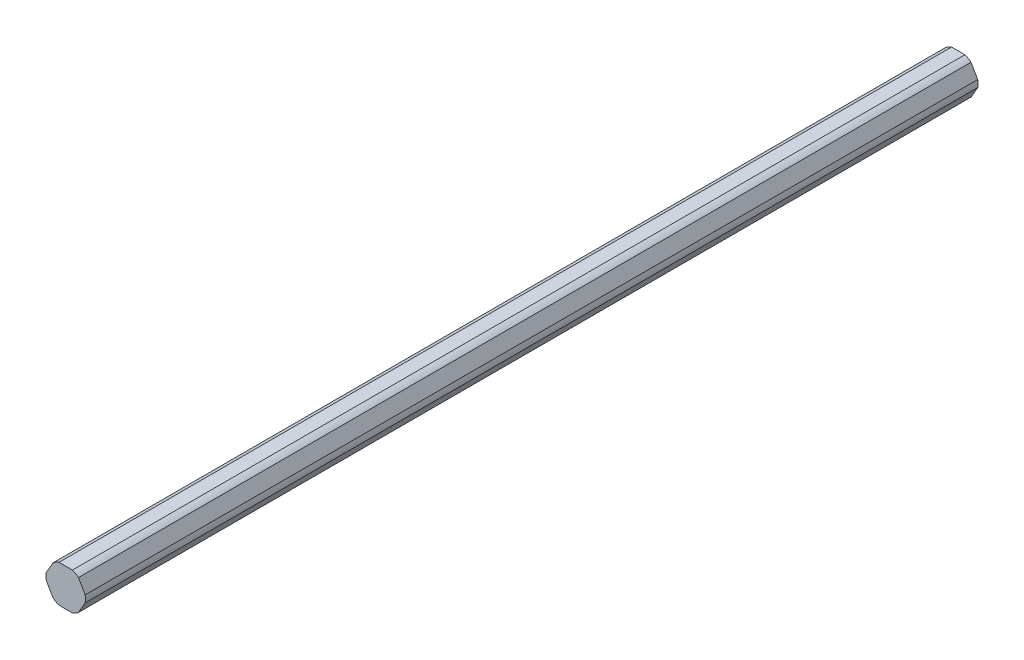
ISO-10303-21;
HEADER;
FILE_DESCRIPTION(('STEP AP214'),'2;1');
FILE_NAME('part.step','',(''),(''),'','','');
FILE_SCHEMA(('AUTOMOTIVE_DESIGN { 1 0 10303 214 1 1 1 1 }'));
ENDSEC;
DATA;
#1=APPLICATION_CONTEXT('core data for automotive mechanical design processes');
#2=APPLICATION_PROTOCOL_DEFINITION('international standard','automotive_design',2000,#1);
#3=PRODUCT_CONTEXT('',#1,'mechanical');
#4=PRODUCT('Part','Part','',(#3));
#5=PRODUCT_RELATED_PRODUCT_CATEGORY('part','',(#4));
#6=PRODUCT_DEFINITION_FORMATION('','',#4);
#7=PRODUCT_DEFINITION_CONTEXT('part definition',#1,'design');
#8=PRODUCT_DEFINITION('design','',#6,#7);
#9=PRODUCT_DEFINITION_SHAPE('','',#8);
#10=(LENGTH_UNIT() NAMED_UNIT(*) SI_UNIT(.MILLI.,.METRE.));
#11=(NAMED_UNIT(*) PLANE_ANGLE_UNIT() SI_UNIT($,.RADIAN.));
#12=(NAMED_UNIT(*) SI_UNIT($,.STERADIAN.) SOLID_ANGLE_UNIT());
#13=UNCERTAINTY_MEASURE_WITH_UNIT(LENGTH_MEASURE(1.E-05),#10,'distance_accuracy_value','');
#14=(GEOMETRIC_REPRESENTATION_CONTEXT(3) GLOBAL_UNCERTAINTY_ASSIGNED_CONTEXT((#13)) GLOBAL_UNIT_ASSIGNED_CONTEXT((#10,
#11,#12)) REPRESENTATION_CONTEXT('',''));
#15=CARTESIAN_POINT('',(0.,0.,0.));
#16=DIRECTION('',(0.,0.,1.));
#17=DIRECTION('',(1.,0.,0.));
#18=AXIS2_PLACEMENT_3D('',#15,#16,#17);
#19=CARTESIAN_POINT('',(5.49926131403119,3.175,304.8));
#20=DIRECTION('',(-0.866025403784439,-0.5,0.));
#21=DIRECTION('',(0.5,-0.866025403784439,0.));
#22=AXIS2_PLACEMENT_3D('',#19,#20,#21);
#23=PLANE('',#22);
#24=DIRECTION('',(-0.5,0.866025403784439,0.));
#25=VECTOR('',#24,1.);
#26=CARTESIAN_POINT('',(5.49926131403119,3.175,0.));
#27=LINE('',#26,#25);
#28=CARTESIAN_POINT('',(6.64381362825714,1.19257723984011,0.));
#29=VERTEX_POINT('',#28);
#30=CARTESIAN_POINT('',(4.35470899980524,5.15742276015989,0.));
#31=VERTEX_POINT('',#30);
#32=EDGE_CURVE('E153',#29,#31,#27,.T.);
#33=ORIENTED_EDGE('',*,*,#32,.T.);
#34=DIRECTION('',(0.,0.,-1.));
#35=VECTOR('',#34,1.);
#36=CARTESIAN_POINT('',(4.35470899980524,5.15742276015989,304.8));
#37=LINE('',#36,#35);
#38=CARTESIAN_POINT('',(4.35470899980524,5.15742276015989,304.8));
#39=VERTEX_POINT('',#38);
#40=EDGE_CURVE('E11',#39,#31,#37,.T.);
#41=ORIENTED_EDGE('',*,*,#40,.F.);
#42=DIRECTION('',(-0.5,0.866025403784439,0.));
#43=VECTOR('',#42,1.);
#44=CARTESIAN_POINT('',(5.49926131403119,3.175,304.8));
#45=LINE('',#44,#43);
#46=CARTESIAN_POINT('',(6.64381362825714,1.19257723984011,304.8));
#47=VERTEX_POINT('',#46);
#48=EDGE_CURVE('E210',#47,#39,#45,.T.);
#49=ORIENTED_EDGE('',*,*,#48,.F.);
#50=DIRECTION('',(0.,0.,-1.));
#51=VECTOR('',#50,1.);
#52=CARTESIAN_POINT('',(6.64381362825714,1.19257723984011,304.8));
#53=LINE('',#52,#51);
#54=EDGE_CURVE('E149',#47,#29,#53,.T.);
#55=ORIENTED_EDGE('',*,*,#54,.T.);
#56=EDGE_LOOP('',(#33,#41,#49,#55));
#57=FACE_BOUND('',#56,.T.);
#58=ADVANCED_FACE('F32',(#57),#23,.F.);
#59=CARTESIAN_POINT('',(0.,0.,304.8));
#60=DIRECTION('',(0.,0.,-1.));
#61=DIRECTION('',(-1.,0.,0.));
#62=AXIS2_PLACEMENT_3D('',#59,#60,#61);
#63=CYLINDRICAL_SURFACE('',#62,6.75);
#64=CARTESIAN_POINT('',(0.,0.,0.));
#65=DIRECTION('',(0.,0.,1.));
#66=DIRECTION('',(1.,0.,0.));
#67=AXIS2_PLACEMENT_3D('',#64,#65,#66);
#68=CIRCLE('',#67,6.75);
#69=CARTESIAN_POINT('',(2.28910462845191,6.35,0.));
#70=VERTEX_POINT('',#69);
#71=EDGE_CURVE('E156',#31,#70,#68,.T.);
#72=ORIENTED_EDGE('',*,*,#71,.T.);
#73=DIRECTION('',(0.,0.,-1.));
#74=VECTOR('',#73,1.);
#75=CARTESIAN_POINT('',(2.28910462845191,6.35,304.8));
#76=LINE('',#75,#74);
#77=CARTESIAN_POINT('',(2.28910462845191,6.35,304.8));
#78=VERTEX_POINT('',#77);
#79=EDGE_CURVE('E40',#78,#70,#76,.T.);
#80=ORIENTED_EDGE('',*,*,#79,.F.);
#81=CARTESIAN_POINT('',(0.,0.,304.8));
#82=DIRECTION('',(0.,0.,1.));
#83=DIRECTION('',(1.,0.,0.));
#84=AXIS2_PLACEMENT_3D('',#81,#82,#83);
#85=CIRCLE('',#84,6.75);
#86=EDGE_CURVE('E103',#39,#78,#85,.T.);
#87=ORIENTED_EDGE('',*,*,#86,.F.);
#88=ORIENTED_EDGE('',*,*,#40,.T.);
#89=EDGE_LOOP('',(#72,#80,#87,#88));
#90=FACE_BOUND('',#89,.T.);
#91=ADVANCED_FACE('F242',(#90),#63,.T.);
#92=CARTESIAN_POINT('',(0.,6.35,304.8));
#93=DIRECTION('',(0.,-1.,0.));
#94=DIRECTION('',(1.,0.,0.));
#95=AXIS2_PLACEMENT_3D('',#92,#93,#94);
#96=PLANE('',#95);
#97=DIRECTION('',(-1.,0.,0.));
#98=VECTOR('',#97,1.);
#99=CARTESIAN_POINT('',(0.,6.35,0.));
#100=LINE('',#99,#98);
#101=CARTESIAN_POINT('',(-2.28910462845191,6.35,0.));
#102=VERTEX_POINT('',#101);
#103=EDGE_CURVE('E158',#70,#102,#100,.T.);
#104=ORIENTED_EDGE('',*,*,#103,.T.);
#105=DIRECTION('',(0.,0.,-1.));
#106=VECTOR('',#105,1.);
#107=CARTESIAN_POINT('',(-2.28910462845191,6.35,304.8));
#108=LINE('',#107,#106);
#109=CARTESIAN_POINT('',(-2.28910462845191,6.35,304.8));
#110=VERTEX_POINT('',#109);
#111=EDGE_CURVE('E188',#110,#102,#108,.T.);
#112=ORIENTED_EDGE('',*,*,#111,.F.);
#113=DIRECTION('',(-1.,0.,0.));
#114=VECTOR('',#113,1.);
#115=CARTESIAN_POINT('',(0.,6.35,304.8));
#116=LINE('',#115,#114);
#117=EDGE_CURVE('E196',#78,#110,#116,.T.);
#118=ORIENTED_EDGE('',*,*,#117,.F.);
#119=ORIENTED_EDGE('',*,*,#79,.T.);
#120=EDGE_LOOP('',(#104,#112,#118,#119));
#121=FACE_BOUND('',#120,.T.);
#122=ADVANCED_FACE('F194',(#121),#96,.F.);
#123=CARTESIAN_POINT('',(-4.35470899980524,5.15742276015989,0.));
#124=VERTEX_POINT('',#123);
#125=EDGE_CURVE('E159',#102,#124,#68,.T.);
#126=ORIENTED_EDGE('',*,*,#125,.T.);
#127=DIRECTION('',(0.,0.,-1.));
#128=VECTOR('',#127,1.);
#129=CARTESIAN_POINT('',(-4.35470899980524,5.15742276015989,304.8));
#130=LINE('',#129,#128);
#131=CARTESIAN_POINT('',(-4.35470899980524,5.15742276015989,304.8));
#132=VERTEX_POINT('',#131);
#133=EDGE_CURVE('E185',#132,#124,#130,.T.);
#134=ORIENTED_EDGE('',*,*,#133,.F.);
#135=EDGE_CURVE('E214',#110,#132,#85,.T.);
#136=ORIENTED_EDGE('',*,*,#135,.F.);
#137=ORIENTED_EDGE('',*,*,#111,.T.);
#138=EDGE_LOOP('',(#126,#134,#136,#137));
#139=FACE_BOUND('',#138,.T.);
#140=ADVANCED_FACE('F226',(#139),#63,.T.);
#141=CARTESIAN_POINT('',(-5.49926131403119,3.175,304.8));
#142=DIRECTION('',(0.866025403784438,-0.5,0.));
#143=DIRECTION('',(0.5,0.866025403784439,0.));
#144=AXIS2_PLACEMENT_3D('',#141,#142,#143);
#145=PLANE('',#144);
#146=DIRECTION('',(-0.5,-0.866025403784439,0.));
#147=VECTOR('',#146,1.);
#148=CARTESIAN_POINT('',(-5.49926131403119,3.175,0.));
#149=LINE('',#148,#147);
#150=CARTESIAN_POINT('',(-6.64381362825714,1.19257723984012,0.));
#151=VERTEX_POINT('',#150);
#152=EDGE_CURVE('E161',#124,#151,#149,.T.);
#153=ORIENTED_EDGE('',*,*,#152,.T.);
#154=DIRECTION('',(0.,0.,-1.));
#155=VECTOR('',#154,1.);
#156=CARTESIAN_POINT('',(-6.64381362825714,1.19257723984012,304.8));
#157=LINE('',#156,#155);
#158=CARTESIAN_POINT('',(-6.64381362825714,1.19257723984012,304.8));
#159=VERTEX_POINT('',#158);
#160=EDGE_CURVE('E182',#159,#151,#157,.T.);
#161=ORIENTED_EDGE('',*,*,#160,.F.);
#162=DIRECTION('',(-0.5,-0.866025403784439,0.));
#163=VECTOR('',#162,1.);
#164=CARTESIAN_POINT('',(-5.49926131403119,3.175,304.8));
#165=LINE('',#164,#163);
#166=EDGE_CURVE('E217',#132,#159,#165,.T.);
#167=ORIENTED_EDGE('',*,*,#166,.F.);
#168=ORIENTED_EDGE('',*,*,#133,.T.);
#169=EDGE_LOOP('',(#153,#161,#167,#168));
#170=FACE_BOUND('',#169,.T.);
#171=ADVANCED_FACE('F228',(#170),#145,.F.);
#172=CARTESIAN_POINT('',(-6.64381362825714,-1.19257723984011,0.));
#173=VERTEX_POINT('',#172);
#174=EDGE_CURVE('E163',#151,#173,#68,.T.);
#175=ORIENTED_EDGE('',*,*,#174,.T.);
#176=DIRECTION('',(0.,0.,-1.));
#177=VECTOR('',#176,1.);
#178=CARTESIAN_POINT('',(-6.64381362825714,-1.19257723984011,304.8));
#179=LINE('',#178,#177);
#180=CARTESIAN_POINT('',(-6.64381362825714,-1.19257723984011,304.8));
#181=VERTEX_POINT('',#180);
#182=EDGE_CURVE('E179',#181,#173,#179,.T.);
#183=ORIENTED_EDGE('',*,*,#182,.F.);
#184=EDGE_CURVE('E218',#159,#181,#85,.T.);
#185=ORIENTED_EDGE('',*,*,#184,.F.);
#186=ORIENTED_EDGE('',*,*,#160,.T.);
#187=EDGE_LOOP('',(#175,#183,#185,#186));
#188=FACE_BOUND('',#187,.T.);
#189=ADVANCED_FACE('F229',(#188),#63,.T.);
#190=CARTESIAN_POINT('',(-5.49926131403119,-3.175,304.8));
#191=DIRECTION('',(0.866025403784439,0.5,0.));
#192=DIRECTION('',(-0.5,0.866025403784439,0.));
#193=AXIS2_PLACEMENT_3D('',#190,#191,#192);
#194=PLANE('',#193);
#195=DIRECTION('',(0.5,-0.866025403784439,0.));
#196=VECTOR('',#195,1.);
#197=CARTESIAN_POINT('',(-5.49926131403119,-3.175,0.));
#198=LINE('',#197,#196);
#199=CARTESIAN_POINT('',(-4.35470899980524,-5.15742276015989,0.));
#200=VERTEX_POINT('',#199);
#201=EDGE_CURVE('E164',#173,#200,#198,.T.);
#202=ORIENTED_EDGE('',*,*,#201,.T.);
#203=DIRECTION('',(0.,0.,-1.));
#204=VECTOR('',#203,1.);
#205=CARTESIAN_POINT('',(-4.35470899980524,-5.15742276015989,304.8));
#206=LINE('',#205,#204);
#207=CARTESIAN_POINT('',(-4.35470899980524,-5.15742276015989,304.8));
#208=VERTEX_POINT('',#207);
#209=EDGE_CURVE('E176',#208,#200,#206,.T.);
#210=ORIENTED_EDGE('',*,*,#209,.F.);
#211=DIRECTION('',(0.5,-0.866025403784439,0.));
#212=VECTOR('',#211,1.);
#213=CARTESIAN_POINT('',(-5.49926131403119,-3.175,304.8));
#214=LINE('',#213,#212);
#215=EDGE_CURVE('E219',#181,#208,#214,.T.);
#216=ORIENTED_EDGE('',*,*,#215,.F.);
#217=ORIENTED_EDGE('',*,*,#182,.T.);
#218=EDGE_LOOP('',(#202,#210,#216,#217));
#219=FACE_BOUND('',#218,.T.);
#220=ADVANCED_FACE('F232',(#219),#194,.F.);
#221=CARTESIAN_POINT('',(-2.28910462845191,-6.35,0.));
#222=VERTEX_POINT('',#221);
#223=EDGE_CURVE('E166',#200,#222,#68,.T.);
#224=ORIENTED_EDGE('',*,*,#223,.T.);
#225=DIRECTION('',(0.,0.,-1.));
#226=VECTOR('',#225,1.);
#227=CARTESIAN_POINT('',(-2.28910462845191,-6.35,304.8));
#228=LINE('',#227,#226);
#229=CARTESIAN_POINT('',(-2.28910462845191,-6.35,304.8));
#230=VERTEX_POINT('',#229);
#231=EDGE_CURVE('E173',#230,#222,#228,.T.);
#232=ORIENTED_EDGE('',*,*,#231,.F.);
#233=EDGE_CURVE('E139',#208,#230,#85,.T.);
#234=ORIENTED_EDGE('',*,*,#233,.F.);
#235=ORIENTED_EDGE('',*,*,#209,.T.);
#236=EDGE_LOOP('',(#224,#232,#234,#235));
#237=FACE_BOUND('',#236,.T.);
#238=ADVANCED_FACE('F234',(#237),#63,.T.);
#239=CARTESIAN_POINT('',(0.,-6.35,304.8));
#240=DIRECTION('',(0.,1.,0.));
#241=DIRECTION('',(0.,0.,1.));
#242=AXIS2_PLACEMENT_3D('',#239,#240,#241);
#243=PLANE('',#242);
#244=DIRECTION('',(1.,0.,0.));
#245=VECTOR('',#244,1.);
#246=CARTESIAN_POINT('',(0.,-6.35,0.));
#247=LINE('',#246,#245);
#248=CARTESIAN_POINT('',(2.28910462845191,-6.35,0.));
#249=VERTEX_POINT('',#248);
#250=EDGE_CURVE('E167',#222,#249,#247,.T.);
#251=ORIENTED_EDGE('',*,*,#250,.T.);
#252=DIRECTION('',(0.,0.,-1.));
#253=VECTOR('',#252,1.);
#254=CARTESIAN_POINT('',(2.28910462845191,-6.35,304.8));
#255=LINE('',#254,#253);
#256=CARTESIAN_POINT('',(2.28910462845191,-6.35,304.8));
#257=VERTEX_POINT('',#256);
#258=EDGE_CURVE('E144',#257,#249,#255,.T.);
#259=ORIENTED_EDGE('',*,*,#258,.F.);
#260=DIRECTION('',(1.,0.,0.));
#261=VECTOR('',#260,1.);
#262=CARTESIAN_POINT('',(0.,-6.35,304.8));
#263=LINE('',#262,#261);
#264=EDGE_CURVE('E134',#230,#257,#263,.T.);
#265=ORIENTED_EDGE('',*,*,#264,.F.);
#266=ORIENTED_EDGE('',*,*,#231,.T.);
#267=EDGE_LOOP('',(#251,#259,#265,#266));
#268=FACE_BOUND('',#267,.T.);
#269=ADVANCED_FACE('F237',(#268),#243,.F.);
#270=CARTESIAN_POINT('',(4.35470899980524,-5.15742276015989,0.));
#271=VERTEX_POINT('',#270);
#272=EDGE_CURVE('E143',#249,#271,#68,.T.);
#273=ORIENTED_EDGE('',*,*,#272,.T.);
#274=DIRECTION('',(0.,0.,-1.));
#275=VECTOR('',#274,1.);
#276=CARTESIAN_POINT('',(4.35470899980524,-5.15742276015989,304.8));
#277=LINE('',#276,#275);
#278=CARTESIAN_POINT('',(4.35470899980524,-5.15742276015989,304.8));
#279=VERTEX_POINT('',#278);
#280=EDGE_CURVE('E140',#279,#271,#277,.T.);
#281=ORIENTED_EDGE('',*,*,#280,.F.);
#282=EDGE_CURVE('E128',#257,#279,#85,.T.);
#283=ORIENTED_EDGE('',*,*,#282,.F.);
#284=ORIENTED_EDGE('',*,*,#258,.T.);
#285=EDGE_LOOP('',(#273,#281,#283,#284));
#286=FACE_BOUND('',#285,.T.);
#287=ADVANCED_FACE('F141',(#286),#63,.T.);
#288=CARTESIAN_POINT('',(5.49926131403119,-3.175,304.8));
#289=DIRECTION('',(-0.866025403784439,0.5,0.));
#290=DIRECTION('',(-0.5,-0.866025403784439,0.));
#291=AXIS2_PLACEMENT_3D('',#288,#289,#290);
#292=PLANE('',#291);
#293=DIRECTION('',(0.5,0.866025403784439,0.));
#294=VECTOR('',#293,1.);
#295=CARTESIAN_POINT('',(5.49926131403119,-3.175,0.));
#296=LINE('',#295,#294);
#297=CARTESIAN_POINT('',(6.64381362825714,-1.19257723984011,0.));
#298=VERTEX_POINT('',#297);
#299=EDGE_CURVE('E89',#271,#298,#296,.T.);
#300=ORIENTED_EDGE('',*,*,#299,.T.);
#301=DIRECTION('',(0.,0.,-1.));
#302=VECTOR('',#301,1.);
#303=CARTESIAN_POINT('',(6.64381362825714,-1.19257723984011,304.8));
#304=LINE('',#303,#302);
#305=CARTESIAN_POINT('',(6.64381362825714,-1.19257723984011,304.8));
#306=VERTEX_POINT('',#305);
#307=EDGE_CURVE('E145',#306,#298,#304,.T.);
#308=ORIENTED_EDGE('',*,*,#307,.F.);
#309=DIRECTION('',(0.5,0.866025403784439,0.));
#310=VECTOR('',#309,1.);
#311=CARTESIAN_POINT('',(5.49926131403119,-3.175,304.8));
#312=LINE('',#311,#310);
#313=EDGE_CURVE('E132',#279,#306,#312,.T.);
#314=ORIENTED_EDGE('',*,*,#313,.F.);
#315=ORIENTED_EDGE('',*,*,#280,.T.);
#316=EDGE_LOOP('',(#300,#308,#314,#315));
#317=FACE_BOUND('',#316,.T.);
#318=ADVANCED_FACE('F147',(#317),#292,.F.);
#319=EDGE_CURVE('E95',#298,#29,#68,.T.);
#320=ORIENTED_EDGE('',*,*,#319,.T.);
#321=ORIENTED_EDGE('',*,*,#54,.F.);
#322=EDGE_CURVE('E48',#306,#47,#85,.T.);
#323=ORIENTED_EDGE('',*,*,#322,.F.);
#324=ORIENTED_EDGE('',*,*,#307,.T.);
#325=EDGE_LOOP('',(#320,#321,#323,#324));
#326=FACE_BOUND('',#325,.T.);
#327=ADVANCED_FACE('F239',(#326),#63,.T.);
#328=CARTESIAN_POINT('',(0.,0.,304.8));
#329=DIRECTION('',(0.,0.,1.));
#330=DIRECTION('',(1.,0.,0.));
#331=AXIS2_PLACEMENT_3D('',#328,#329,#330);
#332=PLANE('',#331);
#333=ORIENTED_EDGE('',*,*,#48,.T.);
#334=ORIENTED_EDGE('',*,*,#86,.T.);
#335=ORIENTED_EDGE('',*,*,#117,.T.);
#336=ORIENTED_EDGE('',*,*,#135,.T.);
#337=ORIENTED_EDGE('',*,*,#166,.T.);
#338=ORIENTED_EDGE('',*,*,#184,.T.);
#339=ORIENTED_EDGE('',*,*,#215,.T.);
#340=ORIENTED_EDGE('',*,*,#233,.T.);
#341=ORIENTED_EDGE('',*,*,#264,.T.);
#342=ORIENTED_EDGE('',*,*,#282,.T.);
#343=ORIENTED_EDGE('',*,*,#313,.T.);
#344=ORIENTED_EDGE('',*,*,#322,.T.);
#345=EDGE_LOOP('',(#333,#334,#335,#336,#337,#338,#339,#340,#341,#342,#343,#344));
#346=FACE_BOUND('',#345,.T.);
#347=ADVANCED_FACE('F130',(#346),#332,.T.);
#348=CARTESIAN_POINT('',(0.,0.,0.));
#349=DIRECTION('',(0.,0.,1.));
#350=DIRECTION('',(1.,0.,0.));
#351=AXIS2_PLACEMENT_3D('',#348,#349,#350);
#352=PLANE('',#351);
#353=ORIENTED_EDGE('',*,*,#32,.F.);
#354=ORIENTED_EDGE('',*,*,#319,.F.);
#355=ORIENTED_EDGE('',*,*,#299,.F.);
#356=ORIENTED_EDGE('',*,*,#272,.F.);
#357=ORIENTED_EDGE('',*,*,#250,.F.);
#358=ORIENTED_EDGE('',*,*,#223,.F.);
#359=ORIENTED_EDGE('',*,*,#201,.F.);
#360=ORIENTED_EDGE('',*,*,#174,.F.);
#361=ORIENTED_EDGE('',*,*,#152,.F.);
#362=ORIENTED_EDGE('',*,*,#125,.F.);
#363=ORIENTED_EDGE('',*,*,#103,.F.);
#364=ORIENTED_EDGE('',*,*,#71,.F.);
#365=EDGE_LOOP('',(#353,#354,#355,#356,#357,#358,#359,#360,#361,#362,#363,#364));
#366=FACE_BOUND('',#365,.T.);
#367=ADVANCED_FACE('F200',(#366),#352,.F.);
#368=CLOSED_SHELL('',(#58,#91,#122,#140,#171,#189,#220,#238,#269,#287,#318,#327,#347,#367));
#369=MANIFOLD_SOLID_BREP('B2',#368);
#370=ADVANCED_BREP_SHAPE_REPRESENTATION('',(#18,#369),#14);
#371=SHAPE_DEFINITION_REPRESENTATION(#9,#370);
ENDSEC;
END-ISO-10303-21;
